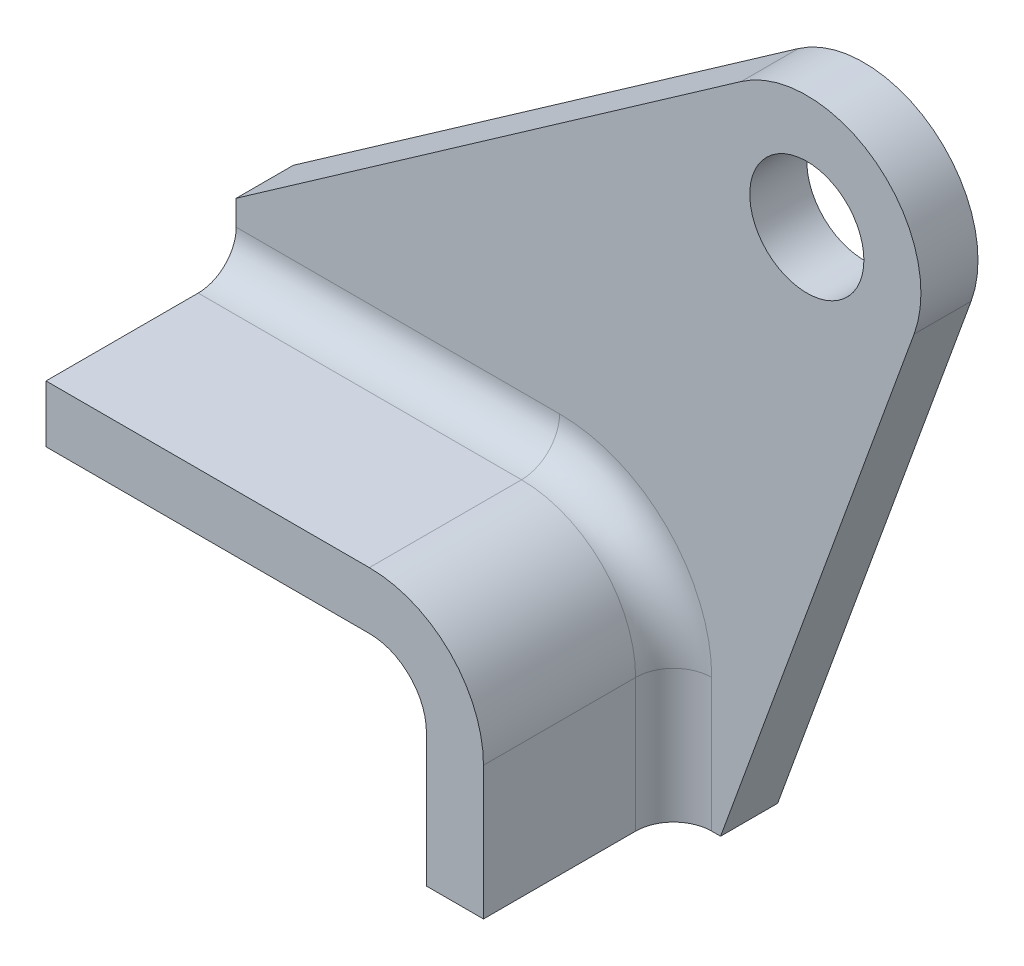
ISO-10303-21;
HEADER;
FILE_DESCRIPTION(('STEP AP214'),'2;1');
FILE_NAME('part.step','',(''),(''),'','','');
FILE_SCHEMA(('AUTOMOTIVE_DESIGN { 1 0 10303 214 1 1 1 1 }'));
ENDSEC;
DATA;
#1=APPLICATION_CONTEXT('core data for automotive mechanical design processes');
#2=APPLICATION_PROTOCOL_DEFINITION('international standard','automotive_design',2000,#1);
#3=PRODUCT_CONTEXT('',#1,'mechanical');
#4=PRODUCT('Part','Part','',(#3));
#5=PRODUCT_RELATED_PRODUCT_CATEGORY('part','',(#4));
#6=PRODUCT_DEFINITION_FORMATION('','',#4);
#7=PRODUCT_DEFINITION_CONTEXT('part definition',#1,'design');
#8=PRODUCT_DEFINITION('design','',#6,#7);
#9=PRODUCT_DEFINITION_SHAPE('','',#8);
#10=(LENGTH_UNIT() NAMED_UNIT(*) SI_UNIT(.MILLI.,.METRE.));
#11=(NAMED_UNIT(*) PLANE_ANGLE_UNIT() SI_UNIT($,.RADIAN.));
#12=(NAMED_UNIT(*) SI_UNIT($,.STERADIAN.) SOLID_ANGLE_UNIT());
#13=UNCERTAINTY_MEASURE_WITH_UNIT(LENGTH_MEASURE(1.E-05),#10,'distance_accuracy_value','');
#14=(GEOMETRIC_REPRESENTATION_CONTEXT(3) GLOBAL_UNCERTAINTY_ASSIGNED_CONTEXT((#13)) GLOBAL_UNIT_ASSIGNED_CONTEXT((#10,
#11,#12)) REPRESENTATION_CONTEXT('',''));
#15=CARTESIAN_POINT('',(0.,0.,0.));
#16=DIRECTION('',(0.,0.,1.));
#17=DIRECTION('',(1.,0.,0.));
#18=AXIS2_PLACEMENT_3D('',#15,#16,#17);
#19=CARTESIAN_POINT('',(-6.,-6.,6.));
#20=DIRECTION('',(0.,0.,-1.));
#21=DIRECTION('',(-1.,0.,0.));
#22=AXIS2_PLACEMENT_3D('',#19,#20,#21);
#23=PLANE('',#22);
#24=CARTESIAN_POINT('',(20.,40.,6.));
#25=DIRECTION('',(0.,0.,1.));
#26=DIRECTION('',(1.,0.,0.));
#27=AXIS2_PLACEMENT_3D('',#24,#25,#26);
#28=CIRCLE('',#27,5.99999999999999);
#29=CARTESIAN_POINT('',(26.,40.,6.));
#30=VERTEX_POINT('',#29);
#31=EDGE_CURVE('E189',#30,#30,#28,.T.);
#32=ORIENTED_EDGE('',*,*,#31,.F.);
#33=EDGE_LOOP('',(#32));
#34=FACE_BOUND('',#33,.T.);
#35=CARTESIAN_POINT('',(-6.,-6.,6.));
#36=DIRECTION('',(0.,0.,-1.));
#37=DIRECTION('',(-1.,0.,0.));
#38=AXIS2_PLACEMENT_3D('',#35,#36,#37);
#39=CIRCLE('',#38,16.);
#40=CARTESIAN_POINT('',(-6.00000000000006,10.,6.));
#41=VERTEX_POINT('',#40);
#42=CARTESIAN_POINT('',(10.,-6.00000000000008,6.));
#43=VERTEX_POINT('',#42);
#44=EDGE_CURVE('E242',#41,#43,#39,.T.);
#45=ORIENTED_EDGE('',*,*,#44,.T.);
#46=DIRECTION('',(0.,1.,0.));
#47=VECTOR('',#46,1.);
#48=CARTESIAN_POINT('',(10.,-20.,6.));
#49=LINE('',#48,#47);
#50=CARTESIAN_POINT('',(10.,-20.,6.));
#51=VERTEX_POINT('',#50);
#52=EDGE_CURVE('E244',#43,#51,#49,.F.);
#53=ORIENTED_EDGE('',*,*,#52,.T.);
#54=DIRECTION('',(1.,0.,0.));
#55=VECTOR('',#54,1.);
#56=CARTESIAN_POINT('',(0.,-20.,6.));
#57=LINE('',#56,#55);
#58=CARTESIAN_POINT('',(10.9319192137381,-20.,6.));
#59=VERTEX_POINT('',#58);
#60=EDGE_CURVE('E197',#51,#59,#57,.T.);
#61=ORIENTED_EDGE('',*,*,#60,.T.);
#62=DIRECTION('',(0.342020143325679,0.939692620785905,0.));
#63=VECTOR('',#62,1.);
#64=CARTESIAN_POINT('',(10.9319192137381,-20.,6.));
#65=LINE('',#64,#63);
#66=CARTESIAN_POINT('',(31.2763114494309,35.8957582800919,6.));
#67=VERTEX_POINT('',#66);
#68=EDGE_CURVE('E200',#59,#67,#65,.T.);
#69=ORIENTED_EDGE('',*,*,#68,.T.);
#70=CARTESIAN_POINT('',(20.,40.,6.));
#71=DIRECTION('',(0.,0.,1.));
#72=DIRECTION('',(1.,0.,0.));
#73=AXIS2_PLACEMENT_3D('',#70,#71,#72);
#74=CIRCLE('',#73,12.);
#75=CARTESIAN_POINT('',(13.1170827637875,49.8298245314679,6.));
#76=VERTEX_POINT('',#75);
#77=EDGE_CURVE('E202',#67,#76,#74,.T.);
#78=ORIENTED_EDGE('',*,*,#77,.T.);
#79=DIRECTION('',(-0.819152044288995,-0.573576436351042,0.));
#80=VECTOR('',#79,1.);
#81=CARTESIAN_POINT('',(13.1170827637875,49.8298245314679,6.));
#82=LINE('',#81,#80);
#83=CARTESIAN_POINT('',(-40.,12.6368427725553,6.));
#84=VERTEX_POINT('',#83);
#85=EDGE_CURVE('E204',#76,#84,#82,.T.);
#86=ORIENTED_EDGE('',*,*,#85,.T.);
#87=DIRECTION('',(0.,-1.,0.));
#88=VECTOR('',#87,1.);
#89=CARTESIAN_POINT('',(-40.,12.6368427725553,6.));
#90=LINE('',#89,#88);
#91=CARTESIAN_POINT('',(-40.,10.,6.));
#92=VERTEX_POINT('',#91);
#93=EDGE_CURVE('E194',#84,#92,#90,.T.);
#94=ORIENTED_EDGE('',*,*,#93,.T.);
#95=DIRECTION('',(-1.,0.,0.));
#96=VECTOR('',#95,1.);
#97=CARTESIAN_POINT('',(-6.00000000000004,10.,6.));
#98=LINE('',#97,#96);
#99=EDGE_CURVE('E240',#92,#41,#98,.F.);
#100=ORIENTED_EDGE('',*,*,#99,.T.);
#101=EDGE_LOOP('',(#45,#53,#61,#69,#78,#86,#94,#100));
#102=FACE_BOUND('',#101,.T.);
#103=ADVANCED_FACE('F34',(#34,#102),#23,.F.);
#104=CARTESIAN_POINT('',(-6.,-6.,0.));
#105=DIRECTION('',(0.,0.,-1.));
#106=DIRECTION('',(-1.,0.,0.));
#107=AXIS2_PLACEMENT_3D('',#104,#105,#106);
#108=PLANE('',#107);
#109=DIRECTION('',(0.,-1.,0.));
#110=VECTOR('',#109,1.);
#111=CARTESIAN_POINT('',(-40.,12.6368427725553,0.));
#112=LINE('',#111,#110);
#113=CARTESIAN_POINT('',(-40.,12.6368427725553,0.));
#114=VERTEX_POINT('',#113);
#115=CARTESIAN_POINT('',(-40.,0.,0.));
#116=VERTEX_POINT('',#115);
#117=EDGE_CURVE('E147',#114,#116,#112,.T.);
#118=ORIENTED_EDGE('',*,*,#117,.F.);
#119=DIRECTION('',(-0.819152044288995,-0.573576436351042,0.));
#120=VECTOR('',#119,1.);
#121=CARTESIAN_POINT('',(13.1170827637875,49.8298245314679,0.));
#122=LINE('',#121,#120);
#123=CARTESIAN_POINT('',(13.1170827637875,49.8298245314679,0.));
#124=VERTEX_POINT('',#123);
#125=EDGE_CURVE('E198',#124,#114,#122,.T.);
#126=ORIENTED_EDGE('',*,*,#125,.F.);
#127=CARTESIAN_POINT('',(20.,40.,0.));
#128=DIRECTION('',(0.,0.,1.));
#129=DIRECTION('',(1.,0.,0.));
#130=AXIS2_PLACEMENT_3D('',#127,#128,#129);
#131=CIRCLE('',#130,12.);
#132=CARTESIAN_POINT('',(31.2763114494309,35.8957582800919,0.));
#133=VERTEX_POINT('',#132);
#134=EDGE_CURVE('E218',#133,#124,#131,.T.);
#135=ORIENTED_EDGE('',*,*,#134,.F.);
#136=DIRECTION('',(0.342020143325679,0.939692620785905,0.));
#137=VECTOR('',#136,1.);
#138=CARTESIAN_POINT('',(10.9319192137381,-20.,0.));
#139=LINE('',#138,#137);
#140=CARTESIAN_POINT('',(10.9319192137381,-20.,0.));
#141=VERTEX_POINT('',#140);
#142=EDGE_CURVE('E216',#141,#133,#139,.T.);
#143=ORIENTED_EDGE('',*,*,#142,.F.);
#144=DIRECTION('',(1.,0.,0.));
#145=VECTOR('',#144,1.);
#146=CARTESIAN_POINT('',(0.,-20.,0.));
#147=LINE('',#146,#145);
#148=CARTESIAN_POINT('',(0.,-20.,0.));
#149=VERTEX_POINT('',#148);
#150=EDGE_CURVE('E214',#149,#141,#147,.T.);
#151=ORIENTED_EDGE('',*,*,#150,.F.);
#152=DIRECTION('',(0.,-1.,0.));
#153=VECTOR('',#152,1.);
#154=CARTESIAN_POINT('',(0.,-6.00000000000004,0.));
#155=LINE('',#154,#153);
#156=CARTESIAN_POINT('',(0.,-6.00000000000004,0.));
#157=VERTEX_POINT('',#156);
#158=EDGE_CURVE('E212',#157,#149,#155,.T.);
#159=ORIENTED_EDGE('',*,*,#158,.F.);
#160=CARTESIAN_POINT('',(-6.,-6.,0.));
#161=DIRECTION('',(0.,0.,-1.));
#162=DIRECTION('',(-1.,0.,0.));
#163=AXIS2_PLACEMENT_3D('',#160,#161,#162);
#164=CIRCLE('',#163,6.);
#165=CARTESIAN_POINT('',(-6.00000000000004,0.,0.));
#166=VERTEX_POINT('',#165);
#167=EDGE_CURVE('E210',#166,#157,#164,.T.);
#168=ORIENTED_EDGE('',*,*,#167,.F.);
#169=DIRECTION('',(1.,0.,0.));
#170=VECTOR('',#169,1.);
#171=CARTESIAN_POINT('',(-40.,0.,0.));
#172=LINE('',#171,#170);
#173=EDGE_CURVE('E208',#116,#166,#172,.T.);
#174=ORIENTED_EDGE('',*,*,#173,.F.);
#175=EDGE_LOOP('',(#118,#126,#135,#143,#151,#159,#168,#174));
#176=FACE_BOUND('',#175,.T.);
#177=CARTESIAN_POINT('',(20.,40.,0.));
#178=DIRECTION('',(0.,0.,1.));
#179=DIRECTION('',(1.,0.,0.));
#180=AXIS2_PLACEMENT_3D('',#177,#178,#179);
#181=CIRCLE('',#180,5.99999999999999);
#182=CARTESIAN_POINT('',(26.,40.,0.));
#183=VERTEX_POINT('',#182);
#184=EDGE_CURVE('E188',#183,#183,#181,.T.);
#185=ORIENTED_EDGE('',*,*,#184,.T.);
#186=EDGE_LOOP('',(#185));
#187=FACE_BOUND('',#186,.T.);
#188=ADVANCED_FACE('F288',(#176,#187),#108,.T.);
#189=CARTESIAN_POINT('',(-40.,12.6368427725553,6.));
#190=DIRECTION('',(1.,0.,0.));
#191=DIRECTION('',(0.,0.,-1.));
#192=AXIS2_PLACEMENT_3D('',#189,#190,#191);
#193=PLANE('',#192);
#194=ORIENTED_EDGE('',*,*,#117,.T.);
#195=DIRECTION('',(0.,0.,-1.));
#196=VECTOR('',#195,1.);
#197=CARTESIAN_POINT('',(-40.,0.,6.));
#198=LINE('',#197,#196);
#199=CARTESIAN_POINT('',(-40.,0.,26.));
#200=VERTEX_POINT('',#199);
#201=EDGE_CURVE('E140',#200,#116,#198,.T.);
#202=ORIENTED_EDGE('',*,*,#201,.F.);
#203=DIRECTION('',(0.,-1.,0.));
#204=VECTOR('',#203,1.);
#205=CARTESIAN_POINT('',(-40.,0.,26.));
#206=LINE('',#205,#204);
#207=CARTESIAN_POINT('',(-40.,6.,26.));
#208=VERTEX_POINT('',#207);
#209=EDGE_CURVE('E144',#208,#200,#206,.T.);
#210=ORIENTED_EDGE('',*,*,#209,.F.);
#211=DIRECTION('',(0.,0.,-1.));
#212=VECTOR('',#211,1.);
#213=CARTESIAN_POINT('',(-40.,6.,26.));
#214=LINE('',#213,#212);
#215=CARTESIAN_POINT('',(-40.,6.,10.));
#216=VERTEX_POINT('',#215);
#217=EDGE_CURVE('E179',#208,#216,#214,.T.);
#218=ORIENTED_EDGE('',*,*,#217,.T.);
#219=CARTESIAN_POINT('',(-40.,10.,10.));
#220=DIRECTION('',(1.,0.,0.));
#221=DIRECTION('',(0.,0.,-1.));
#222=AXIS2_PLACEMENT_3D('',#219,#220,#221);
#223=CIRCLE('',#222,4.);
#224=EDGE_CURVE('E11',#216,#92,#223,.T.);
#225=ORIENTED_EDGE('',*,*,#224,.T.);
#226=ORIENTED_EDGE('',*,*,#93,.F.);
#227=DIRECTION('',(0.,0.,-1.));
#228=VECTOR('',#227,1.);
#229=CARTESIAN_POINT('',(-40.,12.6368427725553,6.));
#230=LINE('',#229,#228);
#231=EDGE_CURVE('E206',#84,#114,#230,.T.);
#232=ORIENTED_EDGE('',*,*,#231,.T.);
#233=EDGE_LOOP('',(#194,#202,#210,#218,#225,#226,#232));
#234=FACE_BOUND('',#233,.T.);
#235=ADVANCED_FACE('F142',(#234),#193,.F.);
#236=CARTESIAN_POINT('',(-40.,0.,6.));
#237=DIRECTION('',(0.,1.,0.));
#238=DIRECTION('',(0.,0.,1.));
#239=AXIS2_PLACEMENT_3D('',#236,#237,#238);
#240=PLANE('',#239);
#241=ORIENTED_EDGE('',*,*,#173,.T.);
#242=DIRECTION('',(0.,0.,-1.));
#243=VECTOR('',#242,1.);
#244=CARTESIAN_POINT('',(-6.00000000000004,0.,6.));
#245=LINE('',#244,#243);
#246=CARTESIAN_POINT('',(-6.00000000000004,0.,26.));
#247=VERTEX_POINT('',#246);
#248=EDGE_CURVE('E150',#247,#166,#245,.T.);
#249=ORIENTED_EDGE('',*,*,#248,.F.);
#250=DIRECTION('',(1.,0.,0.));
#251=VECTOR('',#250,1.);
#252=CARTESIAN_POINT('',(-40.,0.,26.));
#253=LINE('',#252,#251);
#254=EDGE_CURVE('E153',#200,#247,#253,.T.);
#255=ORIENTED_EDGE('',*,*,#254,.F.);
#256=ORIENTED_EDGE('',*,*,#201,.T.);
#257=EDGE_LOOP('',(#241,#249,#255,#256));
#258=FACE_BOUND('',#257,.T.);
#259=ADVANCED_FACE('F154',(#258),#240,.F.);
#260=CARTESIAN_POINT('',(-6.,-6.,6.));
#261=DIRECTION('',(0.,0.,-1.));
#262=DIRECTION('',(-1.,0.,0.));
#263=AXIS2_PLACEMENT_3D('',#260,#261,#262);
#264=CYLINDRICAL_SURFACE('',#263,6.);
#265=ORIENTED_EDGE('',*,*,#167,.T.);
#266=DIRECTION('',(0.,0.,-1.));
#267=VECTOR('',#266,1.);
#268=CARTESIAN_POINT('',(0.,-6.00000000000004,6.));
#269=LINE('',#268,#267);
#270=CARTESIAN_POINT('',(0.,-6.00000000000004,26.));
#271=VERTEX_POINT('',#270);
#272=EDGE_CURVE('E234',#271,#157,#269,.T.);
#273=ORIENTED_EDGE('',*,*,#272,.F.);
#274=CARTESIAN_POINT('',(-6.,-6.,26.));
#275=DIRECTION('',(0.,0.,-1.));
#276=DIRECTION('',(1.,0.,0.));
#277=AXIS2_PLACEMENT_3D('',#274,#275,#276);
#278=CIRCLE('',#277,6.);
#279=EDGE_CURVE('E159',#247,#271,#278,.T.);
#280=ORIENTED_EDGE('',*,*,#279,.F.);
#281=ORIENTED_EDGE('',*,*,#248,.T.);
#282=EDGE_LOOP('',(#265,#273,#280,#281));
#283=FACE_BOUND('',#282,.T.);
#284=ADVANCED_FACE('F318',(#283),#264,.F.);
#285=CARTESIAN_POINT('',(0.,-6.00000000000004,6.));
#286=DIRECTION('',(1.,0.,0.));
#287=DIRECTION('',(0.,1.,0.));
#288=AXIS2_PLACEMENT_3D('',#285,#286,#287);
#289=PLANE('',#288);
#290=ORIENTED_EDGE('',*,*,#158,.T.);
#291=DIRECTION('',(0.,0.,-1.));
#292=VECTOR('',#291,1.);
#293=CARTESIAN_POINT('',(0.,-20.,6.));
#294=LINE('',#293,#292);
#295=CARTESIAN_POINT('',(0.,-20.,26.));
#296=VERTEX_POINT('',#295);
#297=EDGE_CURVE('E231',#296,#149,#294,.T.);
#298=ORIENTED_EDGE('',*,*,#297,.F.);
#299=DIRECTION('',(0.,-1.,0.));
#300=VECTOR('',#299,1.);
#301=CARTESIAN_POINT('',(0.,-6.00000000000004,26.));
#302=LINE('',#301,#300);
#303=EDGE_CURVE('E169',#271,#296,#302,.T.);
#304=ORIENTED_EDGE('',*,*,#303,.F.);
#305=ORIENTED_EDGE('',*,*,#272,.T.);
#306=EDGE_LOOP('',(#290,#298,#304,#305));
#307=FACE_BOUND('',#306,.T.);
#308=ADVANCED_FACE('F315',(#307),#289,.F.);
#309=CARTESIAN_POINT('',(0.,-20.,6.));
#310=DIRECTION('',(0.,1.,0.));
#311=DIRECTION('',(-1.,0.,0.));
#312=AXIS2_PLACEMENT_3D('',#309,#310,#311);
#313=PLANE('',#312);
#314=ORIENTED_EDGE('',*,*,#150,.T.);
#315=DIRECTION('',(0.,0.,-1.));
#316=VECTOR('',#315,1.);
#317=CARTESIAN_POINT('',(10.9319192137381,-20.,6.));
#318=LINE('',#317,#316);
#319=EDGE_CURVE('E228',#59,#141,#318,.T.);
#320=ORIENTED_EDGE('',*,*,#319,.F.);
#321=ORIENTED_EDGE('',*,*,#60,.F.);
#322=CARTESIAN_POINT('',(10.,-20.,10.));
#323=DIRECTION('',(0.,1.,0.));
#324=DIRECTION('',(-1.,0.,0.));
#325=AXIS2_PLACEMENT_3D('',#322,#323,#324);
#326=CIRCLE('',#325,4.);
#327=CARTESIAN_POINT('',(6.,-20.,10.));
#328=VERTEX_POINT('',#327);
#329=EDGE_CURVE('E43',#51,#328,#326,.T.);
#330=ORIENTED_EDGE('',*,*,#329,.T.);
#331=DIRECTION('',(0.,0.,-1.));
#332=VECTOR('',#331,1.);
#333=CARTESIAN_POINT('',(6.,-20.,26.));
#334=LINE('',#333,#332);
#335=CARTESIAN_POINT('',(6.,-20.,26.));
#336=VERTEX_POINT('',#335);
#337=EDGE_CURVE('E185',#336,#328,#334,.T.);
#338=ORIENTED_EDGE('',*,*,#337,.F.);
#339=DIRECTION('',(1.,0.,0.));
#340=VECTOR('',#339,1.);
#341=CARTESIAN_POINT('',(0.,-20.,26.));
#342=LINE('',#341,#340);
#343=EDGE_CURVE('E172',#296,#336,#342,.T.);
#344=ORIENTED_EDGE('',*,*,#343,.F.);
#345=ORIENTED_EDGE('',*,*,#297,.T.);
#346=EDGE_LOOP('',(#314,#320,#321,#330,#338,#344,#345));
#347=FACE_BOUND('',#346,.T.);
#348=ADVANCED_FACE('F268',(#347),#313,.F.);
#349=CARTESIAN_POINT('',(10.9319192137381,-20.,6.));
#350=DIRECTION('',(-0.939692620785904,0.342020143325679,0.));
#351=DIRECTION('',(-0.342020143325679,-0.939692620785905,0.));
#352=AXIS2_PLACEMENT_3D('',#349,#350,#351);
#353=PLANE('',#352);
#354=ORIENTED_EDGE('',*,*,#142,.T.);
#355=DIRECTION('',(0.,0.,-1.));
#356=VECTOR('',#355,1.);
#357=CARTESIAN_POINT('',(31.2763114494309,35.8957582800919,6.));
#358=LINE('',#357,#356);
#359=EDGE_CURVE('E225',#67,#133,#358,.T.);
#360=ORIENTED_EDGE('',*,*,#359,.F.);
#361=ORIENTED_EDGE('',*,*,#68,.F.);
#362=ORIENTED_EDGE('',*,*,#319,.T.);
#363=EDGE_LOOP('',(#354,#360,#361,#362));
#364=FACE_BOUND('',#363,.T.);
#365=ADVANCED_FACE('F308',(#364),#353,.F.);
#366=CARTESIAN_POINT('',(20.,40.,6.));
#367=DIRECTION('',(0.,0.,-1.));
#368=DIRECTION('',(-1.,0.,0.));
#369=AXIS2_PLACEMENT_3D('',#366,#367,#368);
#370=CYLINDRICAL_SURFACE('',#369,12.);
#371=ORIENTED_EDGE('',*,*,#134,.T.);
#372=DIRECTION('',(0.,0.,-1.));
#373=VECTOR('',#372,1.);
#374=CARTESIAN_POINT('',(13.1170827637875,49.8298245314679,6.));
#375=LINE('',#374,#373);
#376=EDGE_CURVE('E222',#76,#124,#375,.T.);
#377=ORIENTED_EDGE('',*,*,#376,.F.);
#378=ORIENTED_EDGE('',*,*,#77,.F.);
#379=ORIENTED_EDGE('',*,*,#359,.T.);
#380=EDGE_LOOP('',(#371,#377,#378,#379));
#381=FACE_BOUND('',#380,.T.);
#382=ADVANCED_FACE('F304',(#381),#370,.T.);
#383=CARTESIAN_POINT('',(13.1170827637875,49.8298245314679,6.));
#384=DIRECTION('',(0.573576436351042,-0.819152044288995,0.));
#385=DIRECTION('',(0.819152044288995,0.573576436351042,0.));
#386=AXIS2_PLACEMENT_3D('',#383,#384,#385);
#387=PLANE('',#386);
#388=ORIENTED_EDGE('',*,*,#125,.T.);
#389=ORIENTED_EDGE('',*,*,#231,.F.);
#390=ORIENTED_EDGE('',*,*,#85,.F.);
#391=ORIENTED_EDGE('',*,*,#376,.T.);
#392=EDGE_LOOP('',(#388,#389,#390,#391));
#393=FACE_BOUND('',#392,.T.);
#394=ADVANCED_FACE('F301',(#393),#387,.F.);
#395=CARTESIAN_POINT('',(20.,40.,6.));
#396=DIRECTION('',(0.,0.,-1.));
#397=DIRECTION('',(-1.,0.,0.));
#398=AXIS2_PLACEMENT_3D('',#395,#396,#397);
#399=CYLINDRICAL_SURFACE('',#398,5.99999999999999);
#400=ORIENTED_EDGE('',*,*,#31,.T.);
#401=EDGE_LOOP('',(#400));
#402=FACE_BOUND('',#401,.T.);
#403=ORIENTED_EDGE('',*,*,#184,.F.);
#404=EDGE_LOOP('',(#403));
#405=FACE_BOUND('',#404,.T.);
#406=ADVANCED_FACE('F298',(#402,#405),#399,.F.);
#407=CARTESIAN_POINT('',(6.,-6.00000000000008,26.));
#408=DIRECTION('',(-1.,0.,0.));
#409=DIRECTION('',(0.,-1.,0.));
#410=AXIS2_PLACEMENT_3D('',#407,#408,#409);
#411=PLANE('',#410);
#412=ORIENTED_EDGE('',*,*,#337,.T.);
#413=DIRECTION('',(0.,1.,0.));
#414=VECTOR('',#413,1.);
#415=CARTESIAN_POINT('',(6.,-6.00000000000008,10.));
#416=LINE('',#415,#414);
#417=CARTESIAN_POINT('',(6.,-6.00000000000008,10.));
#418=VERTEX_POINT('',#417);
#419=EDGE_CURVE('E149',#328,#418,#416,.T.);
#420=ORIENTED_EDGE('',*,*,#419,.T.);
#421=DIRECTION('',(0.,0.,-1.));
#422=VECTOR('',#421,1.);
#423=CARTESIAN_POINT('',(6.,-6.00000000000008,26.));
#424=LINE('',#423,#422);
#425=CARTESIAN_POINT('',(6.,-6.00000000000008,26.));
#426=VERTEX_POINT('',#425);
#427=EDGE_CURVE('E183',#426,#418,#424,.T.);
#428=ORIENTED_EDGE('',*,*,#427,.F.);
#429=DIRECTION('',(0.,1.,0.));
#430=VECTOR('',#429,1.);
#431=CARTESIAN_POINT('',(6.,-6.00000000000008,26.));
#432=LINE('',#431,#430);
#433=EDGE_CURVE('E174',#336,#426,#432,.T.);
#434=ORIENTED_EDGE('',*,*,#433,.F.);
#435=EDGE_LOOP('',(#412,#420,#428,#434));
#436=FACE_BOUND('',#435,.T.);
#437=ADVANCED_FACE('F260',(#436),#411,.F.);
#438=CARTESIAN_POINT('',(-6.,-6.,26.));
#439=DIRECTION('',(0.,0.,-1.));
#440=DIRECTION('',(-1.,0.,0.));
#441=AXIS2_PLACEMENT_3D('',#438,#439,#440);
#442=CYLINDRICAL_SURFACE('',#441,12.);
#443=ORIENTED_EDGE('',*,*,#427,.T.);
#444=CARTESIAN_POINT('',(-6.,-6.,10.));
#445=DIRECTION('',(0.,0.,-1.));
#446=DIRECTION('',(-1.,0.,0.));
#447=AXIS2_PLACEMENT_3D('',#444,#445,#446);
#448=CIRCLE('',#447,12.);
#449=CARTESIAN_POINT('',(-6.00000000000004,6.,10.));
#450=VERTEX_POINT('',#449);
#451=EDGE_CURVE('E59',#418,#450,#448,.F.);
#452=ORIENTED_EDGE('',*,*,#451,.T.);
#453=DIRECTION('',(0.,0.,-1.));
#454=VECTOR('',#453,1.);
#455=CARTESIAN_POINT('',(-6.00000000000004,6.,26.));
#456=LINE('',#455,#454);
#457=CARTESIAN_POINT('',(-6.00000000000004,6.,26.));
#458=VERTEX_POINT('',#457);
#459=EDGE_CURVE('E181',#458,#450,#456,.T.);
#460=ORIENTED_EDGE('',*,*,#459,.F.);
#461=CARTESIAN_POINT('',(-6.,-6.,26.));
#462=DIRECTION('',(0.,0.,1.));
#463=DIRECTION('',(1.,0.,0.));
#464=AXIS2_PLACEMENT_3D('',#461,#462,#463);
#465=CIRCLE('',#464,12.);
#466=EDGE_CURVE('E176',#426,#458,#465,.T.);
#467=ORIENTED_EDGE('',*,*,#466,.F.);
#468=EDGE_LOOP('',(#443,#452,#460,#467));
#469=FACE_BOUND('',#468,.T.);
#470=ADVANCED_FACE('F264',(#469),#442,.T.);
#471=CARTESIAN_POINT('',(-40.,6.,26.));
#472=DIRECTION('',(0.,-1.,0.));
#473=DIRECTION('',(0.,0.,-1.));
#474=AXIS2_PLACEMENT_3D('',#471,#472,#473);
#475=PLANE('',#474);
#476=ORIENTED_EDGE('',*,*,#459,.T.);
#477=DIRECTION('',(-1.,0.,0.));
#478=VECTOR('',#477,1.);
#479=CARTESIAN_POINT('',(-40.,6.,10.));
#480=LINE('',#479,#478);
#481=EDGE_CURVE('E51',#450,#216,#480,.T.);
#482=ORIENTED_EDGE('',*,*,#481,.T.);
#483=ORIENTED_EDGE('',*,*,#217,.F.);
#484=DIRECTION('',(-1.,0.,0.));
#485=VECTOR('',#484,1.);
#486=CARTESIAN_POINT('',(-40.,6.,26.));
#487=LINE('',#486,#485);
#488=EDGE_CURVE('E163',#458,#208,#487,.T.);
#489=ORIENTED_EDGE('',*,*,#488,.F.);
#490=EDGE_LOOP('',(#476,#482,#483,#489));
#491=FACE_BOUND('',#490,.T.);
#492=ADVANCED_FACE('F278',(#491),#475,.F.);
#493=CARTESIAN_POINT('',(-6.,-6.,26.));
#494=DIRECTION('',(0.,0.,1.));
#495=DIRECTION('',(1.,0.,0.));
#496=AXIS2_PLACEMENT_3D('',#493,#494,#495);
#497=PLANE('',#496);
#498=ORIENTED_EDGE('',*,*,#209,.T.);
#499=ORIENTED_EDGE('',*,*,#254,.T.);
#500=ORIENTED_EDGE('',*,*,#279,.T.);
#501=ORIENTED_EDGE('',*,*,#303,.T.);
#502=ORIENTED_EDGE('',*,*,#343,.T.);
#503=ORIENTED_EDGE('',*,*,#433,.T.);
#504=ORIENTED_EDGE('',*,*,#466,.T.);
#505=ORIENTED_EDGE('',*,*,#488,.T.);
#506=EDGE_LOOP('',(#498,#499,#500,#501,#502,#503,#504,#505));
#507=FACE_BOUND('',#506,.T.);
#508=ADVANCED_FACE('F161',(#507),#497,.T.);
#509=CARTESIAN_POINT('',(-40.,10.,10.));
#510=DIRECTION('',(1.,0.,0.));
#511=DIRECTION('',(0.,0.,-1.));
#512=AXIS2_PLACEMENT_3D('',#509,#510,#511);
#513=CYLINDRICAL_SURFACE('',#512,4.);
#514=ORIENTED_EDGE('',*,*,#224,.F.);
#515=ORIENTED_EDGE('',*,*,#481,.F.);
#516=CARTESIAN_POINT('',(-6.00000000000006,10.,10.));
#517=DIRECTION('',(-1.,0.,0.));
#518=DIRECTION('',(0.,-1.,0.));
#519=AXIS2_PLACEMENT_3D('',#516,#517,#518);
#520=CIRCLE('',#519,4.);
#521=EDGE_CURVE('E38',#41,#450,#520,.T.);
#522=ORIENTED_EDGE('',*,*,#521,.F.);
#523=ORIENTED_EDGE('',*,*,#99,.F.);
#524=EDGE_LOOP('',(#514,#515,#522,#523));
#525=FACE_BOUND('',#524,.T.);
#526=ADVANCED_FACE('F36',(#525),#513,.F.);
#527=CARTESIAN_POINT('',(-6.,-6.,10.));
#528=DIRECTION('',(0.,0.,-1.));
#529=DIRECTION('',(-1.,0.,0.));
#530=AXIS2_PLACEMENT_3D('',#527,#528,#529);
#531=TOROIDAL_SURFACE('',#530,16.,4.);
#532=ORIENTED_EDGE('',*,*,#521,.T.);
#533=ORIENTED_EDGE('',*,*,#451,.F.);
#534=CARTESIAN_POINT('',(10.,-6.00000000000008,10.));
#535=DIRECTION('',(0.,1.,0.));
#536=DIRECTION('',(0.,0.,1.));
#537=AXIS2_PLACEMENT_3D('',#534,#535,#536);
#538=CIRCLE('',#537,4.);
#539=EDGE_CURVE('E166',#43,#418,#538,.T.);
#540=ORIENTED_EDGE('',*,*,#539,.F.);
#541=ORIENTED_EDGE('',*,*,#44,.F.);
#542=EDGE_LOOP('',(#532,#533,#540,#541));
#543=FACE_BOUND('',#542,.T.);
#544=ADVANCED_FACE('F256',(#543),#531,.F.);
#545=CARTESIAN_POINT('',(10.,-6.00000000000008,10.));
#546=DIRECTION('',(0.,-1.,0.));
#547=DIRECTION('',(1.,0.,0.));
#548=AXIS2_PLACEMENT_3D('',#545,#546,#547);
#549=CYLINDRICAL_SURFACE('',#548,4.);
#550=ORIENTED_EDGE('',*,*,#329,.F.);
#551=ORIENTED_EDGE('',*,*,#52,.F.);
#552=ORIENTED_EDGE('',*,*,#539,.T.);
#553=ORIENTED_EDGE('',*,*,#419,.F.);
#554=EDGE_LOOP('',(#550,#551,#552,#553));
#555=FACE_BOUND('',#554,.T.);
#556=ADVANCED_FACE('F253',(#555),#549,.F.);
#557=CLOSED_SHELL('',(#103,#188,#235,#259,#284,#308,#348,#365,#382,#394,#406,#437,#470,#492,
#508,#526,#544,#556));
#558=MANIFOLD_SOLID_BREP('B2',#557);
#559=ADVANCED_BREP_SHAPE_REPRESENTATION('',(#18,#558),#14);
#560=SHAPE_DEFINITION_REPRESENTATION(#9,#559);
ENDSEC;
END-ISO-10303-21;
